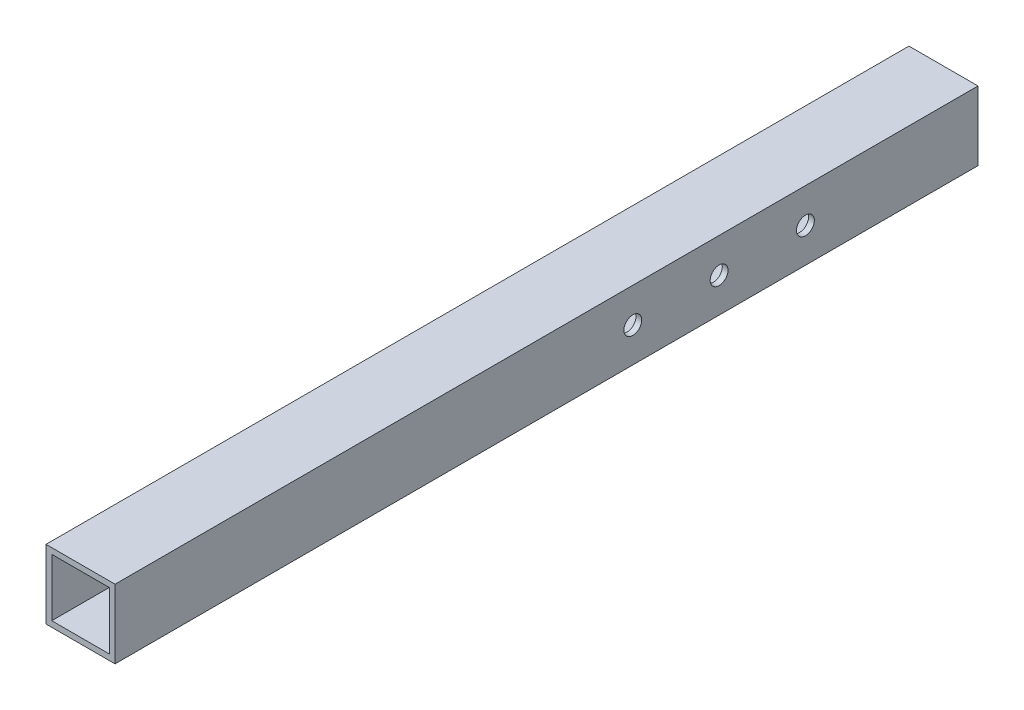
ISO-10303-21;
HEADER;
FILE_DESCRIPTION(('STEP AP214'),'2;1');
FILE_NAME('part.step','',(''),(''),'','','');
FILE_SCHEMA(('AUTOMOTIVE_DESIGN { 1 0 10303 214 1 1 1 1 }'));
ENDSEC;
DATA;
#1=APPLICATION_CONTEXT('core data for automotive mechanical design processes');
#2=APPLICATION_PROTOCOL_DEFINITION('international standard','automotive_design',2000,#1);
#3=PRODUCT_CONTEXT('',#1,'mechanical');
#4=PRODUCT('Part','Part','',(#3));
#5=PRODUCT_RELATED_PRODUCT_CATEGORY('part','',(#4));
#6=PRODUCT_DEFINITION_FORMATION('','',#4);
#7=PRODUCT_DEFINITION_CONTEXT('part definition',#1,'design');
#8=PRODUCT_DEFINITION('design','',#6,#7);
#9=PRODUCT_DEFINITION_SHAPE('','',#8);
#10=(LENGTH_UNIT() NAMED_UNIT(*) SI_UNIT(.MILLI.,.METRE.));
#11=(NAMED_UNIT(*) PLANE_ANGLE_UNIT() SI_UNIT($,.RADIAN.));
#12=(NAMED_UNIT(*) SI_UNIT($,.STERADIAN.) SOLID_ANGLE_UNIT());
#13=UNCERTAINTY_MEASURE_WITH_UNIT(LENGTH_MEASURE(1.E-05),#10,'distance_accuracy_value','');
#14=(GEOMETRIC_REPRESENTATION_CONTEXT(3) GLOBAL_UNCERTAINTY_ASSIGNED_CONTEXT((#13)) GLOBAL_UNIT_ASSIGNED_CONTEXT((#10,
#11,#12)) REPRESENTATION_CONTEXT('',''));
#15=CARTESIAN_POINT('',(0.,0.,0.));
#16=DIRECTION('',(0.,0.,1.));
#17=DIRECTION('',(1.,0.,0.));
#18=AXIS2_PLACEMENT_3D('',#15,#16,#17);
#19=CARTESIAN_POINT('',(0.,0.,150.));
#20=DIRECTION('',(0.,0.,-1.));
#21=DIRECTION('',(-1.,0.,0.));
#22=AXIS2_PLACEMENT_3D('',#19,#20,#21);
#23=PLANE('',#22);
#24=DIRECTION('',(0.,-1.,0.));
#25=VECTOR('',#24,1.);
#26=CARTESIAN_POINT('',(0.,0.,150.));
#27=LINE('',#26,#25);
#28=CARTESIAN_POINT('',(0.,12.,150.));
#29=VERTEX_POINT('',#28);
#30=CARTESIAN_POINT('',(0.,0.,150.));
#31=VERTEX_POINT('',#30);
#32=EDGE_CURVE('E146',#29,#31,#27,.T.);
#33=ORIENTED_EDGE('',*,*,#32,.T.);
#34=DIRECTION('',(1.,0.,0.));
#35=VECTOR('',#34,1.);
#36=CARTESIAN_POINT('',(0.,0.,150.));
#37=LINE('',#36,#35);
#38=CARTESIAN_POINT('',(12.,0.,150.));
#39=VERTEX_POINT('',#38);
#40=EDGE_CURVE('E149',#31,#39,#37,.T.);
#41=ORIENTED_EDGE('',*,*,#40,.T.);
#42=DIRECTION('',(0.,1.,0.));
#43=VECTOR('',#42,1.);
#44=CARTESIAN_POINT('',(12.,0.,150.));
#45=LINE('',#44,#43);
#46=CARTESIAN_POINT('',(12.,12.,150.));
#47=VERTEX_POINT('',#46);
#48=EDGE_CURVE('E152',#39,#47,#45,.T.);
#49=ORIENTED_EDGE('',*,*,#48,.T.);
#50=DIRECTION('',(-1.,0.,0.));
#51=VECTOR('',#50,1.);
#52=CARTESIAN_POINT('',(0.,12.,150.));
#53=LINE('',#52,#51);
#54=EDGE_CURVE('E154',#47,#29,#53,.T.);
#55=ORIENTED_EDGE('',*,*,#54,.T.);
#56=EDGE_LOOP('',(#33,#41,#49,#55));
#57=FACE_BOUND('',#56,.T.);
#58=DIRECTION('',(1.,0.,0.));
#59=VECTOR('',#58,1.);
#60=CARTESIAN_POINT('',(1.,1.,150.));
#61=LINE('',#60,#59);
#62=CARTESIAN_POINT('',(1.,1.,150.));
#63=VERTEX_POINT('',#62);
#64=CARTESIAN_POINT('',(11.,1.,150.));
#65=VERTEX_POINT('',#64);
#66=EDGE_CURVE('E108',#63,#65,#61,.T.);
#67=ORIENTED_EDGE('',*,*,#66,.F.);
#68=DIRECTION('',(0.,-1.,0.));
#69=VECTOR('',#68,1.);
#70=CARTESIAN_POINT('',(1.,1.,150.));
#71=LINE('',#70,#69);
#72=CARTESIAN_POINT('',(1.,11.,150.));
#73=VERTEX_POINT('',#72);
#74=EDGE_CURVE('E130',#73,#63,#71,.T.);
#75=ORIENTED_EDGE('',*,*,#74,.F.);
#76=DIRECTION('',(-1.,0.,0.));
#77=VECTOR('',#76,1.);
#78=CARTESIAN_POINT('',(1.,11.,150.));
#79=LINE('',#78,#77);
#80=CARTESIAN_POINT('',(11.,11.,150.));
#81=VERTEX_POINT('',#80);
#82=EDGE_CURVE('E128',#81,#73,#79,.T.);
#83=ORIENTED_EDGE('',*,*,#82,.F.);
#84=DIRECTION('',(0.,1.,0.));
#85=VECTOR('',#84,1.);
#86=CARTESIAN_POINT('',(11.,1.,150.));
#87=LINE('',#86,#85);
#88=EDGE_CURVE('E116',#65,#81,#87,.T.);
#89=ORIENTED_EDGE('',*,*,#88,.F.);
#90=EDGE_LOOP('',(#67,#75,#83,#89));
#91=FACE_BOUND('',#90,.T.);
#92=ADVANCED_FACE('F41',(#57,#91),#23,.F.);
#93=CARTESIAN_POINT('',(0.,0.,0.));
#94=DIRECTION('',(0.,0.,-1.));
#95=DIRECTION('',(-1.,0.,0.));
#96=AXIS2_PLACEMENT_3D('',#93,#94,#95);
#97=PLANE('',#96);
#98=DIRECTION('',(0.,-1.,0.));
#99=VECTOR('',#98,1.);
#100=CARTESIAN_POINT('',(0.,0.,0.));
#101=LINE('',#100,#99);
#102=CARTESIAN_POINT('',(0.,12.,0.));
#103=VERTEX_POINT('',#102);
#104=CARTESIAN_POINT('',(0.,0.,0.));
#105=VERTEX_POINT('',#104);
#106=EDGE_CURVE('E124',#103,#105,#101,.T.);
#107=ORIENTED_EDGE('',*,*,#106,.F.);
#108=DIRECTION('',(-1.,0.,0.));
#109=VECTOR('',#108,1.);
#110=CARTESIAN_POINT('',(0.,12.,0.));
#111=LINE('',#110,#109);
#112=CARTESIAN_POINT('',(12.,12.,0.));
#113=VERTEX_POINT('',#112);
#114=EDGE_CURVE('E150',#113,#103,#111,.T.);
#115=ORIENTED_EDGE('',*,*,#114,.F.);
#116=DIRECTION('',(0.,1.,0.));
#117=VECTOR('',#116,1.);
#118=CARTESIAN_POINT('',(12.,0.,0.));
#119=LINE('',#118,#117);
#120=CARTESIAN_POINT('',(12.,0.,0.));
#121=VERTEX_POINT('',#120);
#122=EDGE_CURVE('E161',#121,#113,#119,.T.);
#123=ORIENTED_EDGE('',*,*,#122,.F.);
#124=DIRECTION('',(1.,0.,0.));
#125=VECTOR('',#124,1.);
#126=CARTESIAN_POINT('',(0.,0.,0.));
#127=LINE('',#126,#125);
#128=EDGE_CURVE('E159',#105,#121,#127,.T.);
#129=ORIENTED_EDGE('',*,*,#128,.F.);
#130=EDGE_LOOP('',(#107,#115,#123,#129));
#131=FACE_BOUND('',#130,.T.);
#132=DIRECTION('',(0.,-1.,0.));
#133=VECTOR('',#132,1.);
#134=CARTESIAN_POINT('',(1.,1.,0.));
#135=LINE('',#134,#133);
#136=CARTESIAN_POINT('',(1.,11.,0.));
#137=VERTEX_POINT('',#136);
#138=CARTESIAN_POINT('',(1.,1.,0.));
#139=VERTEX_POINT('',#138);
#140=EDGE_CURVE('E117',#137,#139,#135,.T.);
#141=ORIENTED_EDGE('',*,*,#140,.T.);
#142=DIRECTION('',(1.,0.,0.));
#143=VECTOR('',#142,1.);
#144=CARTESIAN_POINT('',(1.,1.,0.));
#145=LINE('',#144,#143);
#146=CARTESIAN_POINT('',(11.,1.,0.));
#147=VERTEX_POINT('',#146);
#148=EDGE_CURVE('E66',#139,#147,#145,.T.);
#149=ORIENTED_EDGE('',*,*,#148,.T.);
#150=DIRECTION('',(0.,1.,0.));
#151=VECTOR('',#150,1.);
#152=CARTESIAN_POINT('',(11.,1.,0.));
#153=LINE('',#152,#151);
#154=CARTESIAN_POINT('',(11.,11.,0.));
#155=VERTEX_POINT('',#154);
#156=EDGE_CURVE('E123',#147,#155,#153,.T.);
#157=ORIENTED_EDGE('',*,*,#156,.T.);
#158=DIRECTION('',(-1.,0.,0.));
#159=VECTOR('',#158,1.);
#160=CARTESIAN_POINT('',(1.,11.,0.));
#161=LINE('',#160,#159);
#162=EDGE_CURVE('E138',#155,#137,#161,.T.);
#163=ORIENTED_EDGE('',*,*,#162,.T.);
#164=EDGE_LOOP('',(#141,#149,#157,#163));
#165=FACE_BOUND('',#164,.T.);
#166=ADVANCED_FACE('F208',(#131,#165),#97,.T.);
#167=CARTESIAN_POINT('',(0.,0.,150.));
#168=DIRECTION('',(1.,0.,0.));
#169=DIRECTION('',(0.,0.,-1.));
#170=AXIS2_PLACEMENT_3D('',#167,#168,#169);
#171=PLANE('',#170);
#172=CARTESIAN_POINT('',(0.,6.,30.));
#173=DIRECTION('',(1.,0.,0.));
#174=DIRECTION('',(0.,0.,-1.));
#175=AXIS2_PLACEMENT_3D('',#172,#173,#174);
#176=CIRCLE('',#175,1.55);
#177=CARTESIAN_POINT('',(0.,6.,28.45));
#178=VERTEX_POINT('',#177);
#179=EDGE_CURVE('E174',#178,#178,#176,.T.);
#180=ORIENTED_EDGE('',*,*,#179,.T.);
#181=EDGE_LOOP('',(#180));
#182=FACE_BOUND('',#181,.T.);
#183=CARTESIAN_POINT('',(0.,6.,45.));
#184=DIRECTION('',(1.,0.,0.));
#185=DIRECTION('',(0.,0.,-1.));
#186=AXIS2_PLACEMENT_3D('',#183,#184,#185);
#187=CIRCLE('',#186,1.55);
#188=CARTESIAN_POINT('',(0.,6.,43.45));
#189=VERTEX_POINT('',#188);
#190=EDGE_CURVE('E262',#189,#189,#187,.T.);
#191=ORIENTED_EDGE('',*,*,#190,.T.);
#192=EDGE_LOOP('',(#191));
#193=FACE_BOUND('',#192,.T.);
#194=CARTESIAN_POINT('',(0.,6.,60.));
#195=DIRECTION('',(1.,0.,0.));
#196=DIRECTION('',(0.,0.,-1.));
#197=AXIS2_PLACEMENT_3D('',#194,#195,#196);
#198=CIRCLE('',#197,1.55);
#199=CARTESIAN_POINT('',(0.,6.,58.45));
#200=VERTEX_POINT('',#199);
#201=EDGE_CURVE('E187',#200,#200,#198,.T.);
#202=ORIENTED_EDGE('',*,*,#201,.T.);
#203=EDGE_LOOP('',(#202));
#204=FACE_BOUND('',#203,.T.);
#205=ORIENTED_EDGE('',*,*,#106,.T.);
#206=DIRECTION('',(0.,0.,-1.));
#207=VECTOR('',#206,1.);
#208=CARTESIAN_POINT('',(0.,0.,150.));
#209=LINE('',#208,#207);
#210=EDGE_CURVE('E11',#31,#105,#209,.T.);
#211=ORIENTED_EDGE('',*,*,#210,.F.);
#212=ORIENTED_EDGE('',*,*,#32,.F.);
#213=DIRECTION('',(0.,0.,-1.));
#214=VECTOR('',#213,1.);
#215=CARTESIAN_POINT('',(0.,12.,150.));
#216=LINE('',#215,#214);
#217=EDGE_CURVE('E156',#29,#103,#216,.T.);
#218=ORIENTED_EDGE('',*,*,#217,.T.);
#219=EDGE_LOOP('',(#205,#211,#212,#218));
#220=FACE_BOUND('',#219,.T.);
#221=ADVANCED_FACE('F43',(#182,#193,#204,#220),#171,.F.);
#222=CARTESIAN_POINT('',(0.,0.,150.));
#223=DIRECTION('',(0.,1.,0.));
#224=DIRECTION('',(0.,0.,1.));
#225=AXIS2_PLACEMENT_3D('',#222,#223,#224);
#226=PLANE('',#225);
#227=ORIENTED_EDGE('',*,*,#128,.T.);
#228=DIRECTION('',(0.,0.,-1.));
#229=VECTOR('',#228,1.);
#230=CARTESIAN_POINT('',(12.,0.,150.));
#231=LINE('',#230,#229);
#232=EDGE_CURVE('E50',#39,#121,#231,.T.);
#233=ORIENTED_EDGE('',*,*,#232,.F.);
#234=ORIENTED_EDGE('',*,*,#40,.F.);
#235=ORIENTED_EDGE('',*,*,#210,.T.);
#236=EDGE_LOOP('',(#227,#233,#234,#235));
#237=FACE_BOUND('',#236,.T.);
#238=ADVANCED_FACE('F235',(#237),#226,.F.);
#239=CARTESIAN_POINT('',(12.,0.,150.));
#240=DIRECTION('',(-1.,0.,0.));
#241=DIRECTION('',(0.,0.,1.));
#242=AXIS2_PLACEMENT_3D('',#239,#240,#241);
#243=PLANE('',#242);
#244=CARTESIAN_POINT('',(12.,6.,30.));
#245=DIRECTION('',(1.,0.,0.));
#246=DIRECTION('',(0.,0.,-1.));
#247=AXIS2_PLACEMENT_3D('',#244,#245,#246);
#248=CIRCLE('',#247,1.55);
#249=CARTESIAN_POINT('',(12.,6.,28.45));
#250=VERTEX_POINT('',#249);
#251=EDGE_CURVE('E275',#250,#250,#248,.T.);
#252=ORIENTED_EDGE('',*,*,#251,.F.);
#253=EDGE_LOOP('',(#252));
#254=FACE_BOUND('',#253,.T.);
#255=CARTESIAN_POINT('',(12.,6.,45.));
#256=DIRECTION('',(1.,0.,0.));
#257=DIRECTION('',(0.,0.,-1.));
#258=AXIS2_PLACEMENT_3D('',#255,#256,#257);
#259=CIRCLE('',#258,1.55);
#260=CARTESIAN_POINT('',(12.,6.,43.45));
#261=VERTEX_POINT('',#260);
#262=EDGE_CURVE('E270',#261,#261,#259,.T.);
#263=ORIENTED_EDGE('',*,*,#262,.F.);
#264=EDGE_LOOP('',(#263));
#265=FACE_BOUND('',#264,.T.);
#266=CARTESIAN_POINT('',(12.,6.,60.));
#267=DIRECTION('',(1.,0.,0.));
#268=DIRECTION('',(0.,0.,-1.));
#269=AXIS2_PLACEMENT_3D('',#266,#267,#268);
#270=CIRCLE('',#269,1.55);
#271=CARTESIAN_POINT('',(12.,6.,58.45));
#272=VERTEX_POINT('',#271);
#273=EDGE_CURVE('E266',#272,#272,#270,.T.);
#274=ORIENTED_EDGE('',*,*,#273,.F.);
#275=EDGE_LOOP('',(#274));
#276=FACE_BOUND('',#275,.T.);
#277=ORIENTED_EDGE('',*,*,#122,.T.);
#278=DIRECTION('',(0.,0.,-1.));
#279=VECTOR('',#278,1.);
#280=CARTESIAN_POINT('',(12.,12.,150.));
#281=LINE('',#280,#279);
#282=EDGE_CURVE('E166',#47,#113,#281,.T.);
#283=ORIENTED_EDGE('',*,*,#282,.F.);
#284=ORIENTED_EDGE('',*,*,#48,.F.);
#285=ORIENTED_EDGE('',*,*,#232,.T.);
#286=EDGE_LOOP('',(#277,#283,#284,#285));
#287=FACE_BOUND('',#286,.T.);
#288=ADVANCED_FACE('F232',(#254,#265,#276,#287),#243,.F.);
#289=CARTESIAN_POINT('',(0.,12.,150.));
#290=DIRECTION('',(0.,-1.,0.));
#291=DIRECTION('',(0.,0.,-1.));
#292=AXIS2_PLACEMENT_3D('',#289,#290,#291);
#293=PLANE('',#292);
#294=ORIENTED_EDGE('',*,*,#114,.T.);
#295=ORIENTED_EDGE('',*,*,#217,.F.);
#296=ORIENTED_EDGE('',*,*,#54,.F.);
#297=ORIENTED_EDGE('',*,*,#282,.T.);
#298=EDGE_LOOP('',(#294,#295,#296,#297));
#299=FACE_BOUND('',#298,.T.);
#300=ADVANCED_FACE('F229',(#299),#293,.F.);
#301=CARTESIAN_POINT('',(1.,1.,150.));
#302=DIRECTION('',(0.,1.,0.));
#303=DIRECTION('',(0.,0.,1.));
#304=AXIS2_PLACEMENT_3D('',#301,#302,#303);
#305=PLANE('',#304);
#306=ORIENTED_EDGE('',*,*,#148,.F.);
#307=DIRECTION('',(0.,0.,-1.));
#308=VECTOR('',#307,1.);
#309=CARTESIAN_POINT('',(1.,1.,150.));
#310=LINE('',#309,#308);
#311=EDGE_CURVE('E112',#63,#139,#310,.T.);
#312=ORIENTED_EDGE('',*,*,#311,.F.);
#313=ORIENTED_EDGE('',*,*,#66,.T.);
#314=DIRECTION('',(0.,0.,-1.));
#315=VECTOR('',#314,1.);
#316=CARTESIAN_POINT('',(11.,1.,150.));
#317=LINE('',#316,#315);
#318=EDGE_CURVE('E111',#65,#147,#317,.T.);
#319=ORIENTED_EDGE('',*,*,#318,.T.);
#320=EDGE_LOOP('',(#306,#312,#313,#319));
#321=FACE_BOUND('',#320,.T.);
#322=ADVANCED_FACE('F110',(#321),#305,.T.);
#323=CARTESIAN_POINT('',(11.,1.,150.));
#324=DIRECTION('',(-1.,0.,0.));
#325=DIRECTION('',(0.,0.,1.));
#326=AXIS2_PLACEMENT_3D('',#323,#324,#325);
#327=PLANE('',#326);
#328=CARTESIAN_POINT('',(11.,6.,30.));
#329=DIRECTION('',(-1.,0.,0.));
#330=DIRECTION('',(0.,0.,1.));
#331=AXIS2_PLACEMENT_3D('',#328,#329,#330);
#332=CIRCLE('',#331,1.55);
#333=CARTESIAN_POINT('',(11.,6.,31.55));
#334=VERTEX_POINT('',#333);
#335=EDGE_CURVE('E136',#334,#334,#332,.T.);
#336=ORIENTED_EDGE('',*,*,#335,.F.);
#337=EDGE_LOOP('',(#336));
#338=FACE_BOUND('',#337,.T.);
#339=CARTESIAN_POINT('',(11.,6.,45.));
#340=DIRECTION('',(-1.,0.,0.));
#341=DIRECTION('',(0.,0.,1.));
#342=AXIS2_PLACEMENT_3D('',#339,#340,#341);
#343=CIRCLE('',#342,1.55);
#344=CARTESIAN_POINT('',(11.,6.,46.55));
#345=VERTEX_POINT('',#344);
#346=EDGE_CURVE('E177',#345,#345,#343,.T.);
#347=ORIENTED_EDGE('',*,*,#346,.F.);
#348=EDGE_LOOP('',(#347));
#349=FACE_BOUND('',#348,.T.);
#350=CARTESIAN_POINT('',(11.,6.,60.));
#351=DIRECTION('',(-1.,0.,0.));
#352=DIRECTION('',(0.,0.,1.));
#353=AXIS2_PLACEMENT_3D('',#350,#351,#352);
#354=CIRCLE('',#353,1.55);
#355=CARTESIAN_POINT('',(11.,6.,61.55));
#356=VERTEX_POINT('',#355);
#357=EDGE_CURVE('E173',#356,#356,#354,.T.);
#358=ORIENTED_EDGE('',*,*,#357,.F.);
#359=EDGE_LOOP('',(#358));
#360=FACE_BOUND('',#359,.T.);
#361=ORIENTED_EDGE('',*,*,#156,.F.);
#362=ORIENTED_EDGE('',*,*,#318,.F.);
#363=ORIENTED_EDGE('',*,*,#88,.T.);
#364=DIRECTION('',(0.,0.,-1.));
#365=VECTOR('',#364,1.);
#366=CARTESIAN_POINT('',(11.,11.,150.));
#367=LINE('',#366,#365);
#368=EDGE_CURVE('E125',#81,#155,#367,.T.);
#369=ORIENTED_EDGE('',*,*,#368,.T.);
#370=EDGE_LOOP('',(#361,#362,#363,#369));
#371=FACE_BOUND('',#370,.T.);
#372=ADVANCED_FACE('F120',(#338,#349,#360,#371),#327,.T.);
#373=CARTESIAN_POINT('',(1.,11.,150.));
#374=DIRECTION('',(0.,-1.,0.));
#375=DIRECTION('',(0.,0.,-1.));
#376=AXIS2_PLACEMENT_3D('',#373,#374,#375);
#377=PLANE('',#376);
#378=ORIENTED_EDGE('',*,*,#162,.F.);
#379=ORIENTED_EDGE('',*,*,#368,.F.);
#380=ORIENTED_EDGE('',*,*,#82,.T.);
#381=DIRECTION('',(0.,0.,-1.));
#382=VECTOR('',#381,1.);
#383=CARTESIAN_POINT('',(1.,11.,150.));
#384=LINE('',#383,#382);
#385=EDGE_CURVE('E58',#73,#137,#384,.T.);
#386=ORIENTED_EDGE('',*,*,#385,.T.);
#387=EDGE_LOOP('',(#378,#379,#380,#386));
#388=FACE_BOUND('',#387,.T.);
#389=ADVANCED_FACE('F202',(#388),#377,.T.);
#390=CARTESIAN_POINT('',(1.,1.,150.));
#391=DIRECTION('',(1.,0.,0.));
#392=DIRECTION('',(0.,0.,-1.));
#393=AXIS2_PLACEMENT_3D('',#390,#391,#392);
#394=PLANE('',#393);
#395=CARTESIAN_POINT('',(1.,6.,30.));
#396=DIRECTION('',(1.,0.,0.));
#397=DIRECTION('',(0.,0.,-1.));
#398=AXIS2_PLACEMENT_3D('',#395,#396,#397);
#399=CIRCLE('',#398,1.55);
#400=CARTESIAN_POINT('',(1.,6.,28.45));
#401=VERTEX_POINT('',#400);
#402=EDGE_CURVE('E45',#401,#401,#399,.T.);
#403=ORIENTED_EDGE('',*,*,#402,.F.);
#404=EDGE_LOOP('',(#403));
#405=FACE_BOUND('',#404,.T.);
#406=CARTESIAN_POINT('',(1.,6.,45.));
#407=DIRECTION('',(1.,0.,0.));
#408=DIRECTION('',(0.,0.,-1.));
#409=AXIS2_PLACEMENT_3D('',#406,#407,#408);
#410=CIRCLE('',#409,1.55);
#411=CARTESIAN_POINT('',(1.,6.,43.45));
#412=VERTEX_POINT('',#411);
#413=EDGE_CURVE('E175',#412,#412,#410,.T.);
#414=ORIENTED_EDGE('',*,*,#413,.F.);
#415=EDGE_LOOP('',(#414));
#416=FACE_BOUND('',#415,.T.);
#417=CARTESIAN_POINT('',(1.,6.,60.));
#418=DIRECTION('',(1.,0.,0.));
#419=DIRECTION('',(0.,0.,-1.));
#420=AXIS2_PLACEMENT_3D('',#417,#418,#419);
#421=CIRCLE('',#420,1.55);
#422=CARTESIAN_POINT('',(1.,6.,58.45));
#423=VERTEX_POINT('',#422);
#424=EDGE_CURVE('E171',#423,#423,#421,.T.);
#425=ORIENTED_EDGE('',*,*,#424,.F.);
#426=EDGE_LOOP('',(#425));
#427=FACE_BOUND('',#426,.T.);
#428=ORIENTED_EDGE('',*,*,#140,.F.);
#429=ORIENTED_EDGE('',*,*,#385,.F.);
#430=ORIENTED_EDGE('',*,*,#74,.T.);
#431=ORIENTED_EDGE('',*,*,#311,.T.);
#432=EDGE_LOOP('',(#428,#429,#430,#431));
#433=FACE_BOUND('',#432,.T.);
#434=ADVANCED_FACE('F198',(#405,#416,#427,#433),#394,.T.);
#435=CARTESIAN_POINT('',(0.,6.,60.));
#436=DIRECTION('',(1.,0.,0.));
#437=DIRECTION('',(0.,0.,-1.));
#438=AXIS2_PLACEMENT_3D('',#435,#436,#437);
#439=CYLINDRICAL_SURFACE('',#438,1.55);
#440=ORIENTED_EDGE('',*,*,#424,.T.);
#441=EDGE_LOOP('',(#440));
#442=FACE_BOUND('',#441,.T.);
#443=ORIENTED_EDGE('',*,*,#201,.F.);
#444=EDGE_LOOP('',(#443));
#445=FACE_BOUND('',#444,.T.);
#446=ADVANCED_FACE('F201',(#442,#445),#439,.F.);
#447=CARTESIAN_POINT('',(0.,6.,45.));
#448=DIRECTION('',(1.,0.,0.));
#449=DIRECTION('',(0.,0.,-1.));
#450=AXIS2_PLACEMENT_3D('',#447,#448,#449);
#451=CYLINDRICAL_SURFACE('',#450,1.55);
#452=ORIENTED_EDGE('',*,*,#413,.T.);
#453=EDGE_LOOP('',(#452));
#454=FACE_BOUND('',#453,.T.);
#455=ORIENTED_EDGE('',*,*,#190,.F.);
#456=EDGE_LOOP('',(#455));
#457=FACE_BOUND('',#456,.T.);
#458=ADVANCED_FACE('F290',(#454,#457),#451,.F.);
#459=CARTESIAN_POINT('',(0.,6.,30.));
#460=DIRECTION('',(1.,0.,0.));
#461=DIRECTION('',(0.,0.,-1.));
#462=AXIS2_PLACEMENT_3D('',#459,#460,#461);
#463=CYLINDRICAL_SURFACE('',#462,1.55);
#464=ORIENTED_EDGE('',*,*,#402,.T.);
#465=EDGE_LOOP('',(#464));
#466=FACE_BOUND('',#465,.T.);
#467=ORIENTED_EDGE('',*,*,#179,.F.);
#468=EDGE_LOOP('',(#467));
#469=FACE_BOUND('',#468,.T.);
#470=ADVANCED_FACE('F195',(#466,#469),#463,.F.);
#471=ORIENTED_EDGE('',*,*,#357,.T.);
#472=EDGE_LOOP('',(#471));
#473=FACE_BOUND('',#472,.T.);
#474=ORIENTED_EDGE('',*,*,#273,.T.);
#475=EDGE_LOOP('',(#474));
#476=FACE_BOUND('',#475,.T.);
#477=ADVANCED_FACE('F287',(#473,#476),#439,.F.);
#478=ORIENTED_EDGE('',*,*,#346,.T.);
#479=EDGE_LOOP('',(#478));
#480=FACE_BOUND('',#479,.T.);
#481=ORIENTED_EDGE('',*,*,#262,.T.);
#482=EDGE_LOOP('',(#481));
#483=FACE_BOUND('',#482,.T.);
#484=ADVANCED_FACE('F285',(#480,#483),#451,.F.);
#485=ORIENTED_EDGE('',*,*,#335,.T.);
#486=EDGE_LOOP('',(#485));
#487=FACE_BOUND('',#486,.T.);
#488=ORIENTED_EDGE('',*,*,#251,.T.);
#489=EDGE_LOOP('',(#488));
#490=FACE_BOUND('',#489,.T.);
#491=ADVANCED_FACE('F280',(#487,#490),#463,.F.);
#492=CLOSED_SHELL('',(#92,#166,#221,#238,#288,#300,#322,#372,#389,#434,#446,#458,#470,#477,#484,#491));
#493=MANIFOLD_SOLID_BREP('B2',#492);
#494=ADVANCED_BREP_SHAPE_REPRESENTATION('',(#18,#493),#14);
#495=SHAPE_DEFINITION_REPRESENTATION(#9,#494);
ENDSEC;
END-ISO-10303-21;
